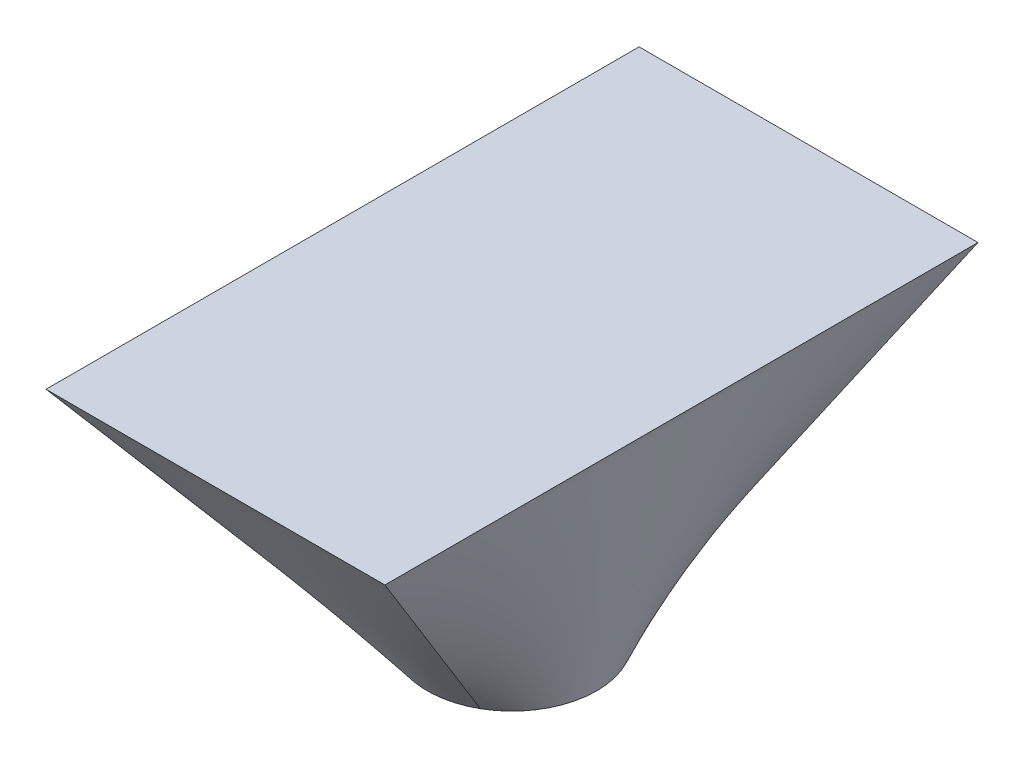
ISO-10303-21;
HEADER;
FILE_DESCRIPTION(('STEP AP214'),'2;1');
FILE_NAME('part.step','',(''),(''),'','','');
FILE_SCHEMA(('AUTOMOTIVE_DESIGN { 1 0 10303 214 1 1 1 1 }'));
ENDSEC;
DATA;
#1=APPLICATION_CONTEXT('core data for automotive mechanical design processes');
#2=APPLICATION_PROTOCOL_DEFINITION('international standard','automotive_design',2000,#1);
#3=PRODUCT_CONTEXT('',#1,'mechanical');
#4=PRODUCT('Part','Part','',(#3));
#5=PRODUCT_RELATED_PRODUCT_CATEGORY('part','',(#4));
#6=PRODUCT_DEFINITION_FORMATION('','',#4);
#7=PRODUCT_DEFINITION_CONTEXT('part definition',#1,'design');
#8=PRODUCT_DEFINITION('design','',#6,#7);
#9=PRODUCT_DEFINITION_SHAPE('','',#8);
#10=(LENGTH_UNIT() NAMED_UNIT(*) SI_UNIT(.MILLI.,.METRE.));
#11=(NAMED_UNIT(*) PLANE_ANGLE_UNIT() SI_UNIT($,.RADIAN.));
#12=(NAMED_UNIT(*) SI_UNIT($,.STERADIAN.) SOLID_ANGLE_UNIT());
#13=UNCERTAINTY_MEASURE_WITH_UNIT(LENGTH_MEASURE(1.E-05),#10,'distance_accuracy_value','');
#14=(GEOMETRIC_REPRESENTATION_CONTEXT(3) GLOBAL_UNCERTAINTY_ASSIGNED_CONTEXT((#13)) GLOBAL_UNIT_ASSIGNED_CONTEXT((#10,
#11,#12)) REPRESENTATION_CONTEXT('',''));
#15=CARTESIAN_POINT('',(0.,0.,0.));
#16=DIRECTION('',(0.,0.,1.));
#17=DIRECTION('',(1.,0.,0.));
#18=AXIS2_PLACEMENT_3D('',#15,#16,#17);
#19=CARTESIAN_POINT('',(0.,10.,0.));
#20=DIRECTION('',(0.,-1.,0.));
#21=DIRECTION('',(0.,0.,-1.));
#22=AXIS2_PLACEMENT_3D('',#19,#20,#21);
#23=PLANE('',#22);
#24=DIRECTION('',(0.,0.,-1.));
#25=VECTOR('',#24,1.);
#26=CARTESIAN_POINT('',(6.,10.,10.5));
#27=LINE('',#26,#25);
#28=CARTESIAN_POINT('',(6.,10.,10.5));
#29=VERTEX_POINT('',#28);
#30=CARTESIAN_POINT('',(6.,10.,-10.5));
#31=VERTEX_POINT('',#30);
#32=EDGE_CURVE('E135',#29,#31,#27,.T.);
#33=ORIENTED_EDGE('',*,*,#32,.T.);
#34=DIRECTION('',(-1.,0.,0.));
#35=VECTOR('',#34,1.);
#36=CARTESIAN_POINT('',(-6.,10.,-10.5));
#37=LINE('',#36,#35);
#38=CARTESIAN_POINT('',(-6.,10.,-10.5));
#39=VERTEX_POINT('',#38);
#40=EDGE_CURVE('E283',#31,#39,#37,.T.);
#41=ORIENTED_EDGE('',*,*,#40,.T.);
#42=DIRECTION('',(0.,0.,1.));
#43=VECTOR('',#42,1.);
#44=CARTESIAN_POINT('',(-6.,10.,10.5));
#45=LINE('',#44,#43);
#46=CARTESIAN_POINT('',(-6.,10.,10.5));
#47=VERTEX_POINT('',#46);
#48=EDGE_CURVE('E73',#39,#47,#45,.T.);
#49=ORIENTED_EDGE('',*,*,#48,.T.);
#50=DIRECTION('',(1.,0.,0.));
#51=VECTOR('',#50,1.);
#52=CARTESIAN_POINT('',(-6.,10.,10.5));
#53=LINE('',#52,#51);
#54=EDGE_CURVE('E12',#47,#29,#53,.T.);
#55=ORIENTED_EDGE('',*,*,#54,.T.);
#56=EDGE_LOOP('',(#33,#41,#49,#55));
#57=FACE_BOUND('',#56,.T.);
#58=ADVANCED_FACE('F63',(#57),#23,.F.);
#59=CARTESIAN_POINT('',(0.,0.,0.));
#60=DIRECTION('',(0.,1.,0.));
#61=DIRECTION('',(0.,0.,1.));
#62=AXIS2_PLACEMENT_3D('',#59,#60,#61);
#63=PLANE('',#62);
#64=CARTESIAN_POINT('',(0.,0.,0.));
#65=DIRECTION('',(0.,1.,0.));
#66=DIRECTION('',(0.,0.,1.));
#67=AXIS2_PLACEMENT_3D('',#64,#65,#66);
#68=CIRCLE('',#67,1.4);
#69=CARTESIAN_POINT('',(0.,0.,1.4));
#70=VERTEX_POINT('',#69);
#71=EDGE_CURVE('E233',#70,#70,#68,.T.);
#72=ORIENTED_EDGE('',*,*,#71,.T.);
#73=EDGE_LOOP('',(#72));
#74=FACE_BOUND('',#73,.T.);
#75=CARTESIAN_POINT('',(0.,0.,0.));
#76=DIRECTION('',(0.,1.,0.));
#77=DIRECTION('',(0.,0.,1.));
#78=AXIS2_PLACEMENT_3D('',#75,#76,#77);
#79=CIRCLE('',#78,3.);
#80=CARTESIAN_POINT('',(1.4884168150705,0.,2.60472942637338));
#81=VERTEX_POINT('',#80);
#82=CARTESIAN_POINT('',(1.4884168150705,0.,-2.60472942637338));
#83=VERTEX_POINT('',#82);
#84=EDGE_CURVE('E108',#81,#83,#79,.T.);
#85=ORIENTED_EDGE('',*,*,#84,.F.);
#86=CARTESIAN_POINT('',(-1.4884168150705,0.,2.60472942637338));
#87=VERTEX_POINT('',#86);
#88=EDGE_CURVE('E113',#87,#81,#79,.T.);
#89=ORIENTED_EDGE('',*,*,#88,.F.);
#90=CARTESIAN_POINT('',(-1.4884168150705,0.,-2.60472942637338));
#91=VERTEX_POINT('',#90);
#92=EDGE_CURVE('E130',#91,#87,#79,.T.);
#93=ORIENTED_EDGE('',*,*,#92,.F.);
#94=EDGE_CURVE('E115',#83,#91,#79,.T.);
#95=ORIENTED_EDGE('',*,*,#94,.F.);
#96=EDGE_LOOP('',(#85,#89,#93,#95));
#97=FACE_BOUND('',#96,.T.);
#98=ADVANCED_FACE('F111',(#74,#97),#63,.F.);
#99=CARTESIAN_POINT('',(-1.4884168150705,0.,-2.60472942637338));
#100=CARTESIAN_POINT('',(-6.,10.,-10.5));
#101=CARTESIAN_POINT('',(-1.67687835353204,0.,-2.49703711868107));
#102=CARTESIAN_POINT('',(-6.,10.,-9.625));
#103=CARTESIAN_POINT('',(-1.86587673725539,0.,-2.36178216143275));
#104=CARTESIAN_POINT('',(-6.,10.,-8.75));
#105=CARTESIAN_POINT('',(-2.22294259741189,0.,-2.02929475072115));
#106=CARTESIAN_POINT('',(-6.,10.,-7.00000000000001));
#107=CARTESIAN_POINT('',(-2.39081697893058,0.,-1.83183494665808));
#108=CARTESIAN_POINT('',(-6.,10.,-6.12500000000001));
#109=CARTESIAN_POINT('',(-2.67731737309281,0.,-1.37970894839309));
#110=CARTESIAN_POINT('',(-6.,10.,-4.37500000000001));
#111=CARTESIAN_POINT('',(-2.79555494332083,0.,-1.12500252640481));
#112=CARTESIAN_POINT('',(-6.,10.,-3.50000000000001));
#113=CARTESIAN_POINT('',(-2.95707119440631,0.,-0.580075923267979));
#114=CARTESIAN_POINT('',(-6.,10.,-1.75000000000001));
#115=CARTESIAN_POINT('',(-3.,0.,-0.29016126773561));
#116=CARTESIAN_POINT('',(-6.,10.,-0.875000000000012));
#117=CARTESIAN_POINT('',(-3.,0.,0.290161267735611));
#118=CARTESIAN_POINT('',(-6.,10.,0.874999999999988));
#119=CARTESIAN_POINT('',(-2.95707119440631,0.,0.58007592326798));
#120=CARTESIAN_POINT('',(-6.,10.,1.74999999999999));
#121=CARTESIAN_POINT('',(-2.79555494332083,0.,1.12500252640481));
#122=CARTESIAN_POINT('',(-6.,10.,3.49999999999999));
#123=CARTESIAN_POINT('',(-2.67731737309281,0.,1.37970894839309));
#124=CARTESIAN_POINT('',(-6.,10.,4.37499999999999));
#125=CARTESIAN_POINT('',(-2.39081697893058,0.,1.83183494665808));
#126=CARTESIAN_POINT('',(-6.,10.,6.12499999999999));
#127=CARTESIAN_POINT('',(-2.22294259741189,0.,2.02929475072115));
#128=CARTESIAN_POINT('',(-6.,10.,6.99999999999999));
#129=CARTESIAN_POINT('',(-1.86587673725539,0.,2.36178216143275));
#130=CARTESIAN_POINT('',(-6.,10.,8.75));
#131=CARTESIAN_POINT('',(-1.67687835353204,0.,2.49703711868107));
#132=CARTESIAN_POINT('',(-6.,10.,9.625));
#133=CARTESIAN_POINT('',(-1.4884168150705,0.,2.60472942637338));
#134=CARTESIAN_POINT('',(-6.,10.,10.5));
#135=B_SPLINE_SURFACE_WITH_KNOTS('',3,1,((#99,#100),(#101,#102),(#103,#104),(#105,#106),(#107,
#108),(#109,#110),(#111,#112),(#113,#114),(#115,#116),(#117,#118),(#119,#120),(#121,#122),(#123,
#124),(#125,#126),(#127,#128),(#129,#130),(#131,#132),(#133,#134)),.UNSPECIFIED.,.F.,.F.,.F.,(4,
2,2,2,2,2,2,2,4),(2,2),(0.,0.125,0.25,0.375,0.5,0.625,0.75,0.875,1.),(0.,1.),.UNSPECIFIED.);
#136=DIRECTION('',(-0.333788954693097,0.739848831355003,0.58413067071292));
#137=VECTOR('',#136,1.);
#138=CARTESIAN_POINT('',(-3.74420840753525,5.,6.55236471318669));
#139=LINE('',#138,#137);
#140=EDGE_CURVE('E88',#87,#47,#139,.T.);
#141=DIRECTION('',(0.333788954693097,-0.739848831355003,0.58413067071292));
#142=VECTOR('',#141,1.);
#143=CARTESIAN_POINT('',(-3.74420840753525,5.,-6.55236471318669));
#144=LINE('',#143,#142);
#145=EDGE_CURVE('E121',#39,#91,#144,.T.);
#146=ORIENTED_EDGE('',*,*,#92,.T.);
#147=ORIENTED_EDGE('',*,*,#140,.T.);
#148=ORIENTED_EDGE('',*,*,#48,.F.);
#149=ORIENTED_EDGE('',*,*,#145,.T.);
#150=EDGE_LOOP('',(#146,#147,#148,#149));
#151=FACE_BOUND('',#150,.T.);
#152=ADVANCED_FACE('F166',(#151),#135,.T.);
#153=CARTESIAN_POINT('',(-1.4884168150705,0.,2.60472942637338));
#154=CARTESIAN_POINT('',(-6.,10.,10.5));
#155=CARTESIAN_POINT('',(-1.27303219968589,0.,2.7278063494503));
#156=CARTESIAN_POINT('',(-5.,10.,10.5));
#157=CARTESIAN_POINT('',(-1.03481072730714,0.,2.82794424178207));
#158=CARTESIAN_POINT('',(-4.,10.,10.5));
#159=CARTESIAN_POINT('',(-0.530969440922003,0.,2.96414799373872));
#160=CARTESIAN_POINT('',(-2.,10.,10.5));
#161=CARTESIAN_POINT('',(-0.265564437074637,0.,3.));
#162=CARTESIAN_POINT('',(-0.999999999999999,10.,10.5));
#163=CARTESIAN_POINT('',(0.265564437074637,0.,3.));
#164=CARTESIAN_POINT('',(1.,10.,10.5));
#165=CARTESIAN_POINT('',(0.530969440922002,0.,2.96414799373872));
#166=CARTESIAN_POINT('',(2.,10.,10.5));
#167=CARTESIAN_POINT('',(1.03481072730714,0.,2.82794424178208));
#168=CARTESIAN_POINT('',(4.,10.,10.5));
#169=CARTESIAN_POINT('',(1.27303219968589,0.,2.7278063494503));
#170=CARTESIAN_POINT('',(5.,10.,10.5));
#171=CARTESIAN_POINT('',(1.4884168150705,0.,2.60472942637338));
#172=CARTESIAN_POINT('',(6.,10.,10.5));
#173=B_SPLINE_SURFACE_WITH_KNOTS('',3,1,((#153,#154),(#155,#156),(#157,#158),(#159,#160),(#161,
#162),(#163,#164),(#165,#166),(#167,#168),(#169,#170),(#171,#172)),.UNSPECIFIED.,.F.,.F.,.F.,(4,
2,2,2,4),(2,2),(0.,0.25,0.5,0.75,1.),(0.,1.),.UNSPECIFIED.);
#174=DIRECTION('',(0.333788954693097,0.739848831355003,0.58413067071292));
#175=VECTOR('',#174,1.);
#176=CARTESIAN_POINT('',(3.74420840753525,5.,6.55236471318669));
#177=LINE('',#176,#175);
#178=EDGE_CURVE('E129',#81,#29,#177,.T.);
#179=ORIENTED_EDGE('',*,*,#88,.T.);
#180=ORIENTED_EDGE('',*,*,#178,.T.);
#181=ORIENTED_EDGE('',*,*,#54,.F.);
#182=ORIENTED_EDGE('',*,*,#140,.F.);
#183=EDGE_LOOP('',(#179,#180,#181,#182));
#184=FACE_BOUND('',#183,.T.);
#185=ADVANCED_FACE('F128',(#184),#173,.T.);
#186=CARTESIAN_POINT('',(1.4884168150705,0.,-2.60472942637338));
#187=CARTESIAN_POINT('',(6.,10.,-10.5));
#188=CARTESIAN_POINT('',(1.27303219968589,0.,-2.7278063494503));
#189=CARTESIAN_POINT('',(5.,10.,-10.5));
#190=CARTESIAN_POINT('',(1.03481072730714,0.,-2.82794424178207));
#191=CARTESIAN_POINT('',(4.,10.,-10.5));
#192=CARTESIAN_POINT('',(0.530969440922003,0.,-2.96414799373872));
#193=CARTESIAN_POINT('',(2.00000000000001,10.,-10.5));
#194=CARTESIAN_POINT('',(0.265564437074638,0.,-3.));
#195=CARTESIAN_POINT('',(1.00000000000001,10.,-10.5));
#196=CARTESIAN_POINT('',(-0.265564437074637,0.,-3.));
#197=CARTESIAN_POINT('',(-0.999999999999992,10.,-10.5));
#198=CARTESIAN_POINT('',(-0.530969440922002,0.,-2.96414799373872));
#199=CARTESIAN_POINT('',(-1.99999999999999,10.,-10.5));
#200=CARTESIAN_POINT('',(-1.03481072730714,0.,-2.82794424178207));
#201=CARTESIAN_POINT('',(-4.,10.,-10.5));
#202=CARTESIAN_POINT('',(-1.27303219968589,0.,-2.7278063494503));
#203=CARTESIAN_POINT('',(-5.,10.,-10.5));
#204=CARTESIAN_POINT('',(-1.4884168150705,0.,-2.60472942637338));
#205=CARTESIAN_POINT('',(-6.,10.,-10.5));
#206=B_SPLINE_SURFACE_WITH_KNOTS('',3,1,((#186,#187),(#188,#189),(#190,#191),(#192,#193),(#194,
#195),(#196,#197),(#198,#199),(#200,#201),(#202,#203),(#204,#205)),.UNSPECIFIED.,.F.,.F.,.F.,(4,
2,2,2,4),(2,2),(0.,0.25,0.5,0.75,1.),(0.,1.),.UNSPECIFIED.);
#207=DIRECTION('',(0.333788954693097,0.739848831355003,-0.58413067071292));
#208=VECTOR('',#207,1.);
#209=CARTESIAN_POINT('',(3.74420840753525,5.,-6.55236471318669));
#210=LINE('',#209,#208);
#211=EDGE_CURVE('E137',#83,#31,#210,.T.);
#212=ORIENTED_EDGE('',*,*,#94,.T.);
#213=ORIENTED_EDGE('',*,*,#145,.F.);
#214=ORIENTED_EDGE('',*,*,#40,.F.);
#215=ORIENTED_EDGE('',*,*,#211,.F.);
#216=EDGE_LOOP('',(#212,#213,#214,#215));
#217=FACE_BOUND('',#216,.T.);
#218=ADVANCED_FACE('F165',(#217),#206,.T.);
#219=CARTESIAN_POINT('',(1.4884168150705,0.,2.60472942637338));
#220=CARTESIAN_POINT('',(6.,10.,10.5));
#221=CARTESIAN_POINT('',(1.67687835353204,0.,2.49703711868107));
#222=CARTESIAN_POINT('',(6.,10.,9.625));
#223=CARTESIAN_POINT('',(1.86587673725539,0.,2.36178216143275));
#224=CARTESIAN_POINT('',(6.,10.,8.75));
#225=CARTESIAN_POINT('',(2.22294259741189,0.,2.02929475072115));
#226=CARTESIAN_POINT('',(6.,10.,6.99999999999999));
#227=CARTESIAN_POINT('',(2.39081697893058,0.,1.83183494665808));
#228=CARTESIAN_POINT('',(6.,10.,6.12499999999999));
#229=CARTESIAN_POINT('',(2.67731737309281,0.,1.37970894839309));
#230=CARTESIAN_POINT('',(6.,10.,4.37499999999998));
#231=CARTESIAN_POINT('',(2.79555494332083,0.,1.12500252640481));
#232=CARTESIAN_POINT('',(6.,10.,3.49999999999998));
#233=CARTESIAN_POINT('',(2.95707119440631,0.,0.58007592326798));
#234=CARTESIAN_POINT('',(6.,10.,1.74999999999998));
#235=CARTESIAN_POINT('',(3.,0.,0.290161267735611));
#236=CARTESIAN_POINT('',(6.,10.,0.874999999999981));
#237=CARTESIAN_POINT('',(3.,0.,-0.29016126773561));
#238=CARTESIAN_POINT('',(6.,10.,-0.875000000000018));
#239=CARTESIAN_POINT('',(2.95707119440631,0.,-0.580075923267979));
#240=CARTESIAN_POINT('',(6.,10.,-1.75000000000002));
#241=CARTESIAN_POINT('',(2.79555494332083,0.,-1.12500252640481));
#242=CARTESIAN_POINT('',(6.,10.,-3.50000000000002));
#243=CARTESIAN_POINT('',(2.67731737309281,0.,-1.37970894839309));
#244=CARTESIAN_POINT('',(6.,10.,-4.37500000000001));
#245=CARTESIAN_POINT('',(2.39081697893058,0.,-1.83183494665808));
#246=CARTESIAN_POINT('',(6.,10.,-6.12500000000001));
#247=CARTESIAN_POINT('',(2.22294259741189,0.,-2.02929475072115));
#248=CARTESIAN_POINT('',(6.,10.,-7.00000000000001));
#249=CARTESIAN_POINT('',(1.86587673725539,0.,-2.36178216143274));
#250=CARTESIAN_POINT('',(6.,10.,-8.75));
#251=CARTESIAN_POINT('',(1.67687835353204,0.,-2.49703711868107));
#252=CARTESIAN_POINT('',(6.,10.,-9.625));
#253=CARTESIAN_POINT('',(1.4884168150705,0.,-2.60472942637338));
#254=CARTESIAN_POINT('',(6.,10.,-10.5));
#255=B_SPLINE_SURFACE_WITH_KNOTS('',3,1,((#219,#220),(#221,#222),(#223,#224),(#225,#226),(#227,
#228),(#229,#230),(#231,#232),(#233,#234),(#235,#236),(#237,#238),(#239,#240),(#241,#242),(#243,
#244),(#245,#246),(#247,#248),(#249,#250),(#251,#252),(#253,#254)),.UNSPECIFIED.,.F.,.F.,.F.,(4,
2,2,2,2,2,2,2,4),(2,2),(0.,0.125,0.25,0.375,0.5,0.625,0.75,0.875,1.),(0.,1.),.UNSPECIFIED.);
#256=ORIENTED_EDGE('',*,*,#84,.T.);
#257=ORIENTED_EDGE('',*,*,#211,.T.);
#258=ORIENTED_EDGE('',*,*,#32,.F.);
#259=ORIENTED_EDGE('',*,*,#178,.F.);
#260=EDGE_LOOP('',(#256,#257,#258,#259));
#261=FACE_BOUND('',#260,.T.);
#262=ADVANCED_FACE('F134',(#261),#255,.T.);
#263=CARTESIAN_POINT('',(0.,8.,0.));
#264=DIRECTION('',(0.,-1.,0.));
#265=DIRECTION('',(0.,0.,-1.));
#266=AXIS2_PLACEMENT_3D('',#263,#264,#265);
#267=CYLINDRICAL_SURFACE('',#266,1.4);
#268=CARTESIAN_POINT('',(0.,8.,0.));
#269=DIRECTION('',(0.,1.,0.));
#270=DIRECTION('',(0.,0.,1.));
#271=AXIS2_PLACEMENT_3D('',#268,#269,#270);
#272=CIRCLE('',#271,1.4);
#273=CARTESIAN_POINT('',(0.,8.,1.4));
#274=VERTEX_POINT('',#273);
#275=EDGE_CURVE('E131',#274,#274,#272,.T.);
#276=ORIENTED_EDGE('',*,*,#275,.T.);
#277=EDGE_LOOP('',(#276));
#278=FACE_BOUND('',#277,.T.);
#279=ORIENTED_EDGE('',*,*,#71,.F.);
#280=EDGE_LOOP('',(#279));
#281=FACE_BOUND('',#280,.T.);
#282=ADVANCED_FACE('F250',(#278,#281),#267,.F.);
#283=CARTESIAN_POINT('',(0.,8.,0.));
#284=DIRECTION('',(0.,1.,0.));
#285=DIRECTION('',(0.,0.,1.));
#286=AXIS2_PLACEMENT_3D('',#283,#284,#285);
#287=PLANE('',#286);
#288=ORIENTED_EDGE('',*,*,#275,.F.);
#289=EDGE_LOOP('',(#288));
#290=FACE_BOUND('',#289,.T.);
#291=ADVANCED_FACE('F348',(#290),#287,.F.);
#292=CLOSED_SHELL('',(#58,#98,#152,#185,#218,#262,#282,#291));
#293=MANIFOLD_SOLID_BREP('B2',#292);
#294=ADVANCED_BREP_SHAPE_REPRESENTATION('',(#18,#293),#14);
#295=SHAPE_DEFINITION_REPRESENTATION(#9,#294);
ENDSEC;
END-ISO-10303-21;
